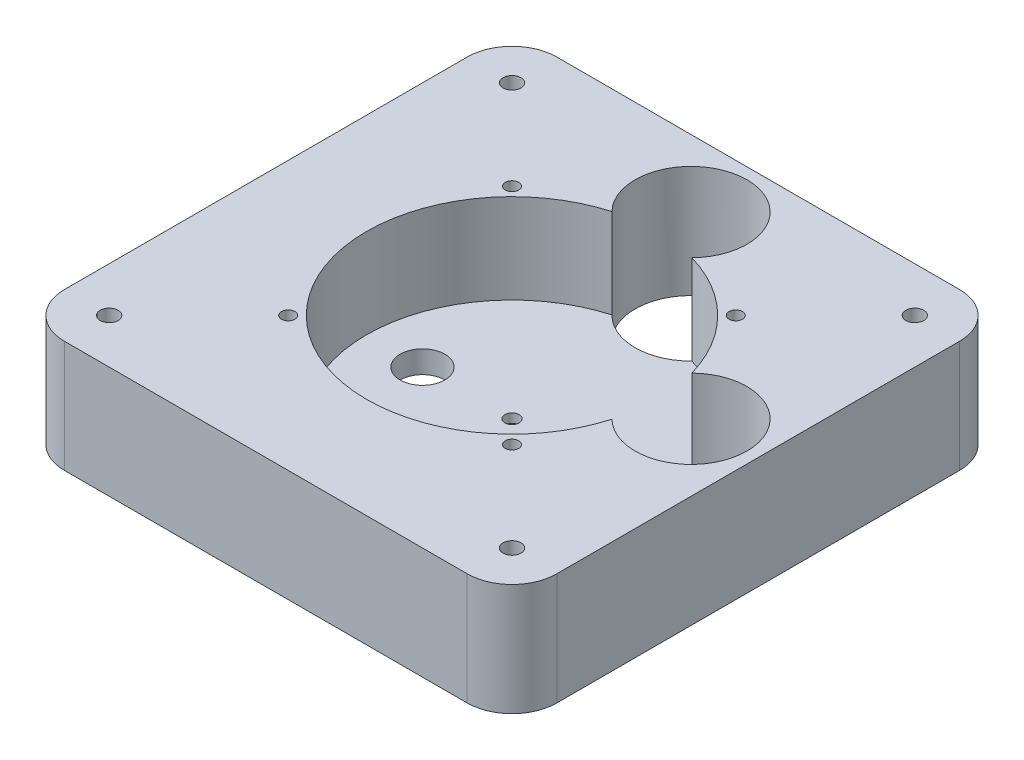
ISO-10303-21;
HEADER;
FILE_DESCRIPTION(('STEP AP214'),'2;1');
FILE_NAME('part.step','',(''),(''),'','','');
FILE_SCHEMA(('AUTOMOTIVE_DESIGN { 1 0 10303 214 1 1 1 1 }'));
ENDSEC;
DATA;
#1=APPLICATION_CONTEXT('core data for automotive mechanical design processes');
#2=APPLICATION_PROTOCOL_DEFINITION('international standard','automotive_design',2000,#1);
#3=PRODUCT_CONTEXT('',#1,'mechanical');
#4=PRODUCT('Part','Part','',(#3));
#5=PRODUCT_RELATED_PRODUCT_CATEGORY('part','',(#4));
#6=PRODUCT_DEFINITION_FORMATION('','',#4);
#7=PRODUCT_DEFINITION_CONTEXT('part definition',#1,'design');
#8=PRODUCT_DEFINITION('design','',#6,#7);
#9=PRODUCT_DEFINITION_SHAPE('','',#8);
#10=(LENGTH_UNIT() NAMED_UNIT(*) SI_UNIT(.MILLI.,.METRE.));
#11=(NAMED_UNIT(*) PLANE_ANGLE_UNIT() SI_UNIT($,.RADIAN.));
#12=(NAMED_UNIT(*) SI_UNIT($,.STERADIAN.) SOLID_ANGLE_UNIT());
#13=UNCERTAINTY_MEASURE_WITH_UNIT(LENGTH_MEASURE(1.E-05),#10,'distance_accuracy_value','');
#14=(GEOMETRIC_REPRESENTATION_CONTEXT(3) GLOBAL_UNCERTAINTY_ASSIGNED_CONTEXT((#13)) GLOBAL_UNIT_ASSIGNED_CONTEXT((#10,
#11,#12)) REPRESENTATION_CONTEXT('',''));
#15=CARTESIAN_POINT('',(0.,0.,0.));
#16=DIRECTION('',(0.,0.,1.));
#17=DIRECTION('',(1.,0.,0.));
#18=AXIS2_PLACEMENT_3D('',#15,#16,#17);
#19=CARTESIAN_POINT('',(25.,0.,-25.));
#20=DIRECTION('',(0.,1.,0.));
#21=DIRECTION('',(0.,0.,1.));
#22=AXIS2_PLACEMENT_3D('',#19,#20,#21);
#23=CYLINDRICAL_SURFACE('',#22,1.5);
#24=CARTESIAN_POINT('',(25.,25.,-25.));
#25=DIRECTION('',(0.,1.,0.));
#26=DIRECTION('',(0.,0.,1.));
#27=AXIS2_PLACEMENT_3D('',#24,#25,#26);
#28=CIRCLE('',#27,1.5);
#29=CARTESIAN_POINT('',(25.,25.,-23.5));
#30=VERTEX_POINT('',#29);
#31=EDGE_CURVE('E272',#30,#30,#28,.T.);
#32=ORIENTED_EDGE('',*,*,#31,.T.);
#33=EDGE_LOOP('',(#32));
#34=FACE_BOUND('',#33,.T.);
#35=CARTESIAN_POINT('',(25.,13.,-25.));
#36=DIRECTION('',(0.,-1.,0.));
#37=DIRECTION('',(0.,0.,-1.));
#38=AXIS2_PLACEMENT_3D('',#35,#36,#37);
#39=CIRCLE('',#38,1.5);
#40=CARTESIAN_POINT('',(25.,13.,-26.5));
#41=VERTEX_POINT('',#40);
#42=EDGE_CURVE('E12',#41,#41,#39,.F.);
#43=ORIENTED_EDGE('',*,*,#42,.F.);
#44=EDGE_LOOP('',(#43));
#45=FACE_BOUND('',#44,.T.);
#46=ADVANCED_FACE('F40',(#34,#45),#23,.F.);
#47=CARTESIAN_POINT('',(-25.,0.,-25.));
#48=DIRECTION('',(0.,1.,0.));
#49=DIRECTION('',(0.,0.,1.));
#50=AXIS2_PLACEMENT_3D('',#47,#48,#49);
#51=CYLINDRICAL_SURFACE('',#50,1.5);
#52=CARTESIAN_POINT('',(-25.,25.,-25.));
#53=DIRECTION('',(0.,1.,0.));
#54=DIRECTION('',(0.,0.,1.));
#55=AXIS2_PLACEMENT_3D('',#52,#53,#54);
#56=CIRCLE('',#55,1.5);
#57=CARTESIAN_POINT('',(-25.,25.,-23.5));
#58=VERTEX_POINT('',#57);
#59=EDGE_CURVE('E276',#58,#58,#56,.T.);
#60=ORIENTED_EDGE('',*,*,#59,.T.);
#61=EDGE_LOOP('',(#60));
#62=FACE_BOUND('',#61,.T.);
#63=CARTESIAN_POINT('',(-25.,13.,-25.));
#64=DIRECTION('',(0.,-1.,0.));
#65=DIRECTION('',(0.,0.,-1.));
#66=AXIS2_PLACEMENT_3D('',#63,#64,#65);
#67=CIRCLE('',#66,1.5);
#68=CARTESIAN_POINT('',(-25.,13.,-26.5));
#69=VERTEX_POINT('',#68);
#70=EDGE_CURVE('E49',#69,#69,#67,.F.);
#71=ORIENTED_EDGE('',*,*,#70,.F.);
#72=EDGE_LOOP('',(#71));
#73=FACE_BOUND('',#72,.T.);
#74=ADVANCED_FACE('F348',(#62,#73),#51,.F.);
#75=CARTESIAN_POINT('',(-25.,0.,25.));
#76=DIRECTION('',(0.,1.,0.));
#77=DIRECTION('',(0.,0.,1.));
#78=AXIS2_PLACEMENT_3D('',#75,#76,#77);
#79=CYLINDRICAL_SURFACE('',#78,1.5);
#80=CARTESIAN_POINT('',(-25.,25.,25.));
#81=DIRECTION('',(0.,1.,0.));
#82=DIRECTION('',(0.,0.,1.));
#83=AXIS2_PLACEMENT_3D('',#80,#81,#82);
#84=CIRCLE('',#83,1.5);
#85=CARTESIAN_POINT('',(-25.,25.,26.5));
#86=VERTEX_POINT('',#85);
#87=EDGE_CURVE('E264',#86,#86,#84,.T.);
#88=ORIENTED_EDGE('',*,*,#87,.T.);
#89=EDGE_LOOP('',(#88));
#90=FACE_BOUND('',#89,.T.);
#91=CARTESIAN_POINT('',(-25.,13.,25.));
#92=DIRECTION('',(0.,-1.,0.));
#93=DIRECTION('',(0.,0.,-1.));
#94=AXIS2_PLACEMENT_3D('',#91,#92,#93);
#95=CIRCLE('',#94,1.5);
#96=CARTESIAN_POINT('',(-25.,13.,23.5));
#97=VERTEX_POINT('',#96);
#98=EDGE_CURVE('E339',#97,#97,#95,.F.);
#99=ORIENTED_EDGE('',*,*,#98,.F.);
#100=EDGE_LOOP('',(#99));
#101=FACE_BOUND('',#100,.T.);
#102=ADVANCED_FACE('F350',(#90,#101),#79,.F.);
#103=CARTESIAN_POINT('',(25.,0.,25.));
#104=DIRECTION('',(0.,1.,0.));
#105=DIRECTION('',(0.,0.,1.));
#106=AXIS2_PLACEMENT_3D('',#103,#104,#105);
#107=CYLINDRICAL_SURFACE('',#106,1.5);
#108=CARTESIAN_POINT('',(25.,25.,25.));
#109=DIRECTION('',(0.,1.,0.));
#110=DIRECTION('',(0.,0.,1.));
#111=AXIS2_PLACEMENT_3D('',#108,#109,#110);
#112=CIRCLE('',#111,1.5);
#113=CARTESIAN_POINT('',(25.,25.,26.5));
#114=VERTEX_POINT('',#113);
#115=EDGE_CURVE('E260',#114,#114,#112,.T.);
#116=ORIENTED_EDGE('',*,*,#115,.T.);
#117=EDGE_LOOP('',(#116));
#118=FACE_BOUND('',#117,.T.);
#119=CARTESIAN_POINT('',(25.,13.,25.));
#120=DIRECTION('',(0.,-1.,0.));
#121=DIRECTION('',(0.,0.,-1.));
#122=AXIS2_PLACEMENT_3D('',#119,#120,#121);
#123=CIRCLE('',#122,1.5);
#124=CARTESIAN_POINT('',(25.,13.,23.5));
#125=VERTEX_POINT('',#124);
#126=EDGE_CURVE('E331',#125,#125,#123,.F.);
#127=ORIENTED_EDGE('',*,*,#126,.F.);
#128=EDGE_LOOP('',(#127));
#129=FACE_BOUND('',#128,.T.);
#130=ADVANCED_FACE('F357',(#118,#129),#107,.F.);
#131=CARTESIAN_POINT('',(0.,-5.,0.));
#132=DIRECTION('',(0.,1.,0.));
#133=DIRECTION('',(0.,0.,1.));
#134=AXIS2_PLACEMENT_3D('',#131,#132,#133);
#135=CYLINDRICAL_SURFACE('',#134,1.6);
#136=CARTESIAN_POINT('',(0.,5.,0.));
#137=DIRECTION('',(0.,1.,0.));
#138=DIRECTION('',(0.,0.,1.));
#139=AXIS2_PLACEMENT_3D('',#136,#137,#138);
#140=CIRCLE('',#139,1.6);
#141=CARTESIAN_POINT('',(0.,5.,1.6));
#142=VERTEX_POINT('',#141);
#143=EDGE_CURVE('E231',#142,#142,#140,.T.);
#144=ORIENTED_EDGE('',*,*,#143,.T.);
#145=EDGE_LOOP('',(#144));
#146=FACE_BOUND('',#145,.T.);
#147=CARTESIAN_POINT('',(0.,3.,0.));
#148=DIRECTION('',(0.,-1.,0.));
#149=DIRECTION('',(0.,0.,-1.));
#150=AXIS2_PLACEMENT_3D('',#147,#148,#149);
#151=CIRCLE('',#150,1.6);
#152=CARTESIAN_POINT('',(0.,3.,-1.6));
#153=VERTEX_POINT('',#152);
#154=EDGE_CURVE('E178',#153,#153,#151,.F.);
#155=ORIENTED_EDGE('',*,*,#154,.F.);
#156=EDGE_LOOP('',(#155));
#157=FACE_BOUND('',#156,.T.);
#158=ADVANCED_FACE('F389',(#146,#157),#135,.F.);
#159=CARTESIAN_POINT('',(0.,25.,0.));
#160=DIRECTION('',(0.,1.,0.));
#161=DIRECTION('',(0.,0.,1.));
#162=AXIS2_PLACEMENT_3D('',#159,#160,#161);
#163=PLANE('',#162);
#164=CARTESIAN_POINT('',(0.,25.,-40.));
#165=DIRECTION('',(0.,1.,0.));
#166=DIRECTION('',(0.,0.,1.));
#167=AXIS2_PLACEMENT_3D('',#164,#165,#166);
#168=CIRCLE('',#167,12.5);
#169=CARTESIAN_POINT('',(8.92678553567856,25.,-31.25));
#170=VERTEX_POINT('',#169);
#171=CARTESIAN_POINT('',(-8.92678553567855,25.,-31.25));
#172=VERTEX_POINT('',#171);
#173=EDGE_CURVE('E302',#170,#172,#168,.T.);
#174=ORIENTED_EDGE('',*,*,#173,.F.);
#175=CARTESIAN_POINT('',(0.,25.,0.));
#176=DIRECTION('',(0.,1.,0.));
#177=DIRECTION('',(0.,0.,1.));
#178=AXIS2_PLACEMENT_3D('',#175,#176,#177);
#179=CIRCLE('',#178,32.5);
#180=CARTESIAN_POINT('',(31.25,25.,-8.92678553567855));
#181=VERTEX_POINT('',#180);
#182=EDGE_CURVE('E299',#181,#170,#179,.T.);
#183=ORIENTED_EDGE('',*,*,#182,.F.);
#184=CARTESIAN_POINT('',(40.,25.,0.));
#185=DIRECTION('',(0.,1.,0.));
#186=DIRECTION('',(0.,0.,1.));
#187=AXIS2_PLACEMENT_3D('',#184,#185,#186);
#188=CIRCLE('',#187,12.5);
#189=CARTESIAN_POINT('',(31.25,25.,8.92678553567856));
#190=VERTEX_POINT('',#189);
#191=EDGE_CURVE('E309',#190,#181,#188,.T.);
#192=ORIENTED_EDGE('',*,*,#191,.F.);
#193=CARTESIAN_POINT('',(0.,25.,0.));
#194=DIRECTION('',(0.,1.,0.));
#195=DIRECTION('',(0.,0.,1.));
#196=AXIS2_PLACEMENT_3D('',#193,#194,#195);
#197=CIRCLE('',#196,32.5);
#198=EDGE_CURVE('E305',#172,#190,#197,.T.);
#199=ORIENTED_EDGE('',*,*,#198,.F.);
#200=EDGE_LOOP('',(#174,#183,#192,#199));
#201=FACE_BOUND('',#200,.T.);
#202=ORIENTED_EDGE('',*,*,#59,.F.);
#203=EDGE_LOOP('',(#202));
#204=FACE_BOUND('',#203,.T.);
#205=CARTESIAN_POINT('',(45.,25.,45.));
#206=DIRECTION('',(0.,1.,0.));
#207=DIRECTION('',(0.,0.,1.));
#208=AXIS2_PLACEMENT_3D('',#205,#206,#207);
#209=CIRCLE('',#208,2.);
#210=CARTESIAN_POINT('',(45.,25.,47.));
#211=VERTEX_POINT('',#210);
#212=EDGE_CURVE('E249',#211,#211,#209,.T.);
#213=ORIENTED_EDGE('',*,*,#212,.F.);
#214=EDGE_LOOP('',(#213));
#215=FACE_BOUND('',#214,.T.);
#216=CARTESIAN_POINT('',(-45.,25.,-45.));
#217=DIRECTION('',(0.,1.,0.));
#218=DIRECTION('',(0.,0.,1.));
#219=AXIS2_PLACEMENT_3D('',#216,#217,#218);
#220=CIRCLE('',#219,2.);
#221=CARTESIAN_POINT('',(-45.,25.,-43.));
#222=VERTEX_POINT('',#221);
#223=EDGE_CURVE('E240',#222,#222,#220,.T.);
#224=ORIENTED_EDGE('',*,*,#223,.F.);
#225=EDGE_LOOP('',(#224));
#226=FACE_BOUND('',#225,.T.);
#227=CARTESIAN_POINT('',(-45.,25.,45.));
#228=DIRECTION('',(0.,1.,0.));
#229=DIRECTION('',(0.,0.,1.));
#230=AXIS2_PLACEMENT_3D('',#227,#228,#229);
#231=CIRCLE('',#230,2.);
#232=CARTESIAN_POINT('',(-45.,25.,47.));
#233=VERTEX_POINT('',#232);
#234=EDGE_CURVE('E235',#233,#233,#231,.T.);
#235=ORIENTED_EDGE('',*,*,#234,.F.);
#236=EDGE_LOOP('',(#235));
#237=FACE_BOUND('',#236,.T.);
#238=ORIENTED_EDGE('',*,*,#31,.F.);
#239=EDGE_LOOP('',(#238));
#240=FACE_BOUND('',#239,.T.);
#241=ORIENTED_EDGE('',*,*,#87,.F.);
#242=EDGE_LOOP('',(#241));
#243=FACE_BOUND('',#242,.T.);
#244=ORIENTED_EDGE('',*,*,#115,.F.);
#245=EDGE_LOOP('',(#244));
#246=FACE_BOUND('',#245,.T.);
#247=CARTESIAN_POINT('',(45.,25.,-45.));
#248=DIRECTION('',(0.,1.,0.));
#249=DIRECTION('',(0.,0.,1.));
#250=AXIS2_PLACEMENT_3D('',#247,#248,#249);
#251=CIRCLE('',#250,2.);
#252=CARTESIAN_POINT('',(45.,25.,-43.));
#253=VERTEX_POINT('',#252);
#254=EDGE_CURVE('E248',#253,#253,#251,.T.);
#255=ORIENTED_EDGE('',*,*,#254,.F.);
#256=EDGE_LOOP('',(#255));
#257=FACE_BOUND('',#256,.T.);
#258=DIRECTION('',(1.,0.,0.));
#259=VECTOR('',#258,1.);
#260=CARTESIAN_POINT('',(44.9999999999999,25.,55.));
#261=LINE('',#260,#259);
#262=CARTESIAN_POINT('',(-44.9999999999999,25.,55.));
#263=VERTEX_POINT('',#262);
#264=CARTESIAN_POINT('',(44.9999999999999,25.,55.));
#265=VERTEX_POINT('',#264);
#266=EDGE_CURVE('E198',#263,#265,#261,.T.);
#267=ORIENTED_EDGE('',*,*,#266,.T.);
#268=CARTESIAN_POINT('',(45.,25.,45.));
#269=DIRECTION('',(0.,1.,0.));
#270=DIRECTION('',(0.,0.,1.));
#271=AXIS2_PLACEMENT_3D('',#268,#269,#270);
#272=CIRCLE('',#271,10.);
#273=CARTESIAN_POINT('',(55.,25.,44.9999999999999));
#274=VERTEX_POINT('',#273);
#275=EDGE_CURVE('E173',#265,#274,#272,.T.);
#276=ORIENTED_EDGE('',*,*,#275,.T.);
#277=DIRECTION('',(0.,0.,-1.));
#278=VECTOR('',#277,1.);
#279=CARTESIAN_POINT('',(55.,25.,44.9999999999999));
#280=LINE('',#279,#278);
#281=CARTESIAN_POINT('',(55.,25.,-44.9999999999999));
#282=VERTEX_POINT('',#281);
#283=EDGE_CURVE('E177',#274,#282,#280,.T.);
#284=ORIENTED_EDGE('',*,*,#283,.T.);
#285=CARTESIAN_POINT('',(45.,25.,-45.));
#286=DIRECTION('',(0.,1.,0.));
#287=DIRECTION('',(0.,0.,1.));
#288=AXIS2_PLACEMENT_3D('',#285,#286,#287);
#289=CIRCLE('',#288,10.);
#290=CARTESIAN_POINT('',(44.9999999999999,25.,-55.));
#291=VERTEX_POINT('',#290);
#292=EDGE_CURVE('E56',#282,#291,#289,.T.);
#293=ORIENTED_EDGE('',*,*,#292,.T.);
#294=DIRECTION('',(-1.,0.,0.));
#295=VECTOR('',#294,1.);
#296=CARTESIAN_POINT('',(44.9999999999999,25.,-55.));
#297=LINE('',#296,#295);
#298=CARTESIAN_POINT('',(-44.9999999999999,25.,-55.));
#299=VERTEX_POINT('',#298);
#300=EDGE_CURVE('E137',#291,#299,#297,.T.);
#301=ORIENTED_EDGE('',*,*,#300,.T.);
#302=CARTESIAN_POINT('',(-45.,25.,-45.));
#303=DIRECTION('',(0.,1.,0.));
#304=DIRECTION('',(0.,0.,1.));
#305=AXIS2_PLACEMENT_3D('',#302,#303,#304);
#306=CIRCLE('',#305,10.);
#307=CARTESIAN_POINT('',(-55.,25.,-44.9999999999999));
#308=VERTEX_POINT('',#307);
#309=EDGE_CURVE('E186',#299,#308,#306,.T.);
#310=ORIENTED_EDGE('',*,*,#309,.T.);
#311=DIRECTION('',(0.,0.,1.));
#312=VECTOR('',#311,1.);
#313=CARTESIAN_POINT('',(-55.,25.,44.9999999999999));
#314=LINE('',#313,#312);
#315=CARTESIAN_POINT('',(-55.,25.,44.9999999999999));
#316=VERTEX_POINT('',#315);
#317=EDGE_CURVE('E190',#308,#316,#314,.T.);
#318=ORIENTED_EDGE('',*,*,#317,.T.);
#319=CARTESIAN_POINT('',(-45.,25.,45.));
#320=DIRECTION('',(0.,1.,0.));
#321=DIRECTION('',(0.,0.,-1.));
#322=AXIS2_PLACEMENT_3D('',#319,#320,#321);
#323=CIRCLE('',#322,10.);
#324=EDGE_CURVE('E194',#316,#263,#323,.T.);
#325=ORIENTED_EDGE('',*,*,#324,.T.);
#326=EDGE_LOOP('',(#267,#276,#284,#293,#301,#310,#318,#325));
#327=FACE_BOUND('',#326,.T.);
#328=ADVANCED_FACE('F387',(#201,#204,#215,#226,#237,#240,#243,#246,#257,#327),#163,.T.);
#329=CARTESIAN_POINT('',(0.,0.,0.));
#330=DIRECTION('',(0.,1.,0.));
#331=DIRECTION('',(0.,0.,1.));
#332=AXIS2_PLACEMENT_3D('',#329,#330,#331);
#333=PLANE('',#332);
#334=CARTESIAN_POINT('',(21.920310216783,0.,-40.));
#335=DIRECTION('',(0.,-1.,0.));
#336=DIRECTION('',(0.,0.,-1.));
#337=AXIS2_PLACEMENT_3D('',#334,#335,#336);
#338=CIRCLE('',#337,3.5);
#339=CARTESIAN_POINT('',(21.920310216783,0.,-43.5));
#340=VERTEX_POINT('',#339);
#341=EDGE_CURVE('E482',#340,#340,#338,.T.);
#342=ORIENTED_EDGE('',*,*,#341,.F.);
#343=EDGE_LOOP('',(#342));
#344=FACE_BOUND('',#343,.T.);
#345=CARTESIAN_POINT('',(40.,0.,-21.920310216783));
#346=DIRECTION('',(0.,-1.,0.));
#347=DIRECTION('',(0.,0.,-1.));
#348=AXIS2_PLACEMENT_3D('',#345,#346,#347);
#349=CIRCLE('',#348,3.5);
#350=CARTESIAN_POINT('',(40.,0.,-25.420310216783));
#351=VERTEX_POINT('',#350);
#352=EDGE_CURVE('E474',#351,#351,#349,.T.);
#353=ORIENTED_EDGE('',*,*,#352,.F.);
#354=EDGE_LOOP('',(#353));
#355=FACE_BOUND('',#354,.T.);
#356=CARTESIAN_POINT('',(40.,0.,21.920310216783));
#357=DIRECTION('',(0.,-1.,0.));
#358=DIRECTION('',(0.,0.,-1.));
#359=AXIS2_PLACEMENT_3D('',#356,#357,#358);
#360=CIRCLE('',#359,3.5);
#361=CARTESIAN_POINT('',(40.,0.,18.420310216783));
#362=VERTEX_POINT('',#361);
#363=EDGE_CURVE('E466',#362,#362,#360,.T.);
#364=ORIENTED_EDGE('',*,*,#363,.F.);
#365=EDGE_LOOP('',(#364));
#366=FACE_BOUND('',#365,.T.);
#367=CARTESIAN_POINT('',(-47.0000000000055,0.,25.0000000000007));
#368=DIRECTION('',(0.,-1.,0.));
#369=DIRECTION('',(0.,0.,-1.));
#370=AXIS2_PLACEMENT_3D('',#367,#368,#369);
#371=CIRCLE('',#370,3.5);
#372=CARTESIAN_POINT('',(-47.0000000000055,0.,21.5000000000007));
#373=VERTEX_POINT('',#372);
#374=EDGE_CURVE('E457',#373,#373,#371,.T.);
#375=ORIENTED_EDGE('',*,*,#374,.F.);
#376=EDGE_LOOP('',(#375));
#377=FACE_BOUND('',#376,.T.);
#378=CARTESIAN_POINT('',(-47.0000000000055,0.,-24.9999999999993));
#379=DIRECTION('',(0.,-1.,0.));
#380=DIRECTION('',(0.,0.,-1.));
#381=AXIS2_PLACEMENT_3D('',#378,#379,#380);
#382=CIRCLE('',#381,3.5);
#383=CARTESIAN_POINT('',(-47.0000000000055,0.,-28.4999999999993));
#384=VERTEX_POINT('',#383);
#385=EDGE_CURVE('E489',#384,#384,#382,.T.);
#386=ORIENTED_EDGE('',*,*,#385,.F.);
#387=EDGE_LOOP('',(#386));
#388=FACE_BOUND('',#387,.T.);
#389=CARTESIAN_POINT('',(-21.920310216783,0.,-40.));
#390=DIRECTION('',(0.,-1.,0.));
#391=DIRECTION('',(0.,0.,-1.));
#392=AXIS2_PLACEMENT_3D('',#389,#390,#391);
#393=CIRCLE('',#392,3.5);
#394=CARTESIAN_POINT('',(-21.920310216783,0.,-43.5));
#395=VERTEX_POINT('',#394);
#396=EDGE_CURVE('E449',#395,#395,#393,.T.);
#397=ORIENTED_EDGE('',*,*,#396,.F.);
#398=EDGE_LOOP('',(#397));
#399=FACE_BOUND('',#398,.T.);
#400=CARTESIAN_POINT('',(0.,0.,0.));
#401=DIRECTION('',(0.,-1.,0.));
#402=DIRECTION('',(0.,0.,-1.));
#403=AXIS2_PLACEMENT_3D('',#400,#401,#402);
#404=CIRCLE('',#403,3.5);
#405=CARTESIAN_POINT('',(0.,0.,-3.5));
#406=VERTEX_POINT('',#405);
#407=EDGE_CURVE('E441',#406,#406,#404,.T.);
#408=ORIENTED_EDGE('',*,*,#407,.F.);
#409=EDGE_LOOP('',(#408));
#410=FACE_BOUND('',#409,.T.);
#411=CARTESIAN_POINT('',(-20.,0.,0.));
#412=DIRECTION('',(0.,-1.,0.));
#413=DIRECTION('',(0.,0.,-1.));
#414=AXIS2_PLACEMENT_3D('',#411,#412,#413);
#415=CIRCLE('',#414,5.);
#416=CARTESIAN_POINT('',(-20.,0.,-5.));
#417=VERTEX_POINT('',#416);
#418=EDGE_CURVE('E283',#417,#417,#415,.T.);
#419=ORIENTED_EDGE('',*,*,#418,.F.);
#420=EDGE_LOOP('',(#419));
#421=FACE_BOUND('',#420,.T.);
#422=CARTESIAN_POINT('',(45.,0.,45.));
#423=DIRECTION('',(0.,1.,0.));
#424=DIRECTION('',(0.,0.,1.));
#425=AXIS2_PLACEMENT_3D('',#422,#423,#424);
#426=CIRCLE('',#425,2.);
#427=CARTESIAN_POINT('',(45.,0.,47.));
#428=VERTEX_POINT('',#427);
#429=EDGE_CURVE('E244',#428,#428,#426,.T.);
#430=ORIENTED_EDGE('',*,*,#429,.T.);
#431=EDGE_LOOP('',(#430));
#432=FACE_BOUND('',#431,.T.);
#433=CARTESIAN_POINT('',(-45.,0.,-45.));
#434=DIRECTION('',(0.,1.,0.));
#435=DIRECTION('',(0.,0.,1.));
#436=AXIS2_PLACEMENT_3D('',#433,#434,#435);
#437=CIRCLE('',#436,2.);
#438=CARTESIAN_POINT('',(-45.,0.,-43.));
#439=VERTEX_POINT('',#438);
#440=EDGE_CURVE('E253',#439,#439,#437,.T.);
#441=ORIENTED_EDGE('',*,*,#440,.T.);
#442=EDGE_LOOP('',(#441));
#443=FACE_BOUND('',#442,.T.);
#444=CARTESIAN_POINT('',(-45.,0.,45.));
#445=DIRECTION('',(0.,1.,0.));
#446=DIRECTION('',(0.,0.,1.));
#447=AXIS2_PLACEMENT_3D('',#444,#445,#446);
#448=CIRCLE('',#447,2.);
#449=CARTESIAN_POINT('',(-45.,0.,47.));
#450=VERTEX_POINT('',#449);
#451=EDGE_CURVE('E236',#450,#450,#448,.T.);
#452=ORIENTED_EDGE('',*,*,#451,.T.);
#453=EDGE_LOOP('',(#452));
#454=FACE_BOUND('',#453,.T.);
#455=CARTESIAN_POINT('',(45.,0.,-45.));
#456=DIRECTION('',(0.,1.,0.));
#457=DIRECTION('',(0.,0.,1.));
#458=AXIS2_PLACEMENT_3D('',#455,#456,#457);
#459=CIRCLE('',#458,2.);
#460=CARTESIAN_POINT('',(45.,0.,-43.));
#461=VERTEX_POINT('',#460);
#462=EDGE_CURVE('E265',#461,#461,#459,.T.);
#463=ORIENTED_EDGE('',*,*,#462,.T.);
#464=EDGE_LOOP('',(#463));
#465=FACE_BOUND('',#464,.T.);
#466=CARTESIAN_POINT('',(0.,0.,-40.));
#467=DIRECTION('',(0.,1.,0.));
#468=DIRECTION('',(0.,0.,1.));
#469=AXIS2_PLACEMENT_3D('',#466,#467,#468);
#470=CIRCLE('',#469,12.5);
#471=CARTESIAN_POINT('',(0.,0.,-27.5));
#472=VERTEX_POINT('',#471);
#473=EDGE_CURVE('E223',#472,#472,#470,.T.);
#474=ORIENTED_EDGE('',*,*,#473,.T.);
#475=EDGE_LOOP('',(#474));
#476=FACE_BOUND('',#475,.T.);
#477=CARTESIAN_POINT('',(40.,0.,0.));
#478=DIRECTION('',(0.,1.,0.));
#479=DIRECTION('',(0.,0.,1.));
#480=AXIS2_PLACEMENT_3D('',#477,#478,#479);
#481=CIRCLE('',#480,12.5);
#482=CARTESIAN_POINT('',(40.,0.,12.5));
#483=VERTEX_POINT('',#482);
#484=EDGE_CURVE('E227',#483,#483,#481,.T.);
#485=ORIENTED_EDGE('',*,*,#484,.T.);
#486=EDGE_LOOP('',(#485));
#487=FACE_BOUND('',#486,.T.);
#488=CARTESIAN_POINT('',(45.,0.,45.));
#489=DIRECTION('',(0.,1.,0.));
#490=DIRECTION('',(0.,0.,1.));
#491=AXIS2_PLACEMENT_3D('',#488,#489,#490);
#492=CIRCLE('',#491,10.);
#493=CARTESIAN_POINT('',(44.9999999999999,0.,55.));
#494=VERTEX_POINT('',#493);
#495=CARTESIAN_POINT('',(55.,0.,44.9999999999999));
#496=VERTEX_POINT('',#495);
#497=EDGE_CURVE('E64',#494,#496,#492,.T.);
#498=ORIENTED_EDGE('',*,*,#497,.F.);
#499=DIRECTION('',(1.,0.,0.));
#500=VECTOR('',#499,1.);
#501=CARTESIAN_POINT('',(44.9999999999999,0.,55.));
#502=LINE('',#501,#500);
#503=CARTESIAN_POINT('',(-44.9999999999999,0.,55.));
#504=VERTEX_POINT('',#503);
#505=EDGE_CURVE('E168',#504,#494,#502,.T.);
#506=ORIENTED_EDGE('',*,*,#505,.F.);
#507=CARTESIAN_POINT('',(-45.,0.,45.));
#508=DIRECTION('',(0.,1.,0.));
#509=DIRECTION('',(0.,0.,-1.));
#510=AXIS2_PLACEMENT_3D('',#507,#508,#509);
#511=CIRCLE('',#510,10.);
#512=CARTESIAN_POINT('',(-55.,0.,44.9999999999999));
#513=VERTEX_POINT('',#512);
#514=EDGE_CURVE('E164',#513,#504,#511,.T.);
#515=ORIENTED_EDGE('',*,*,#514,.F.);
#516=DIRECTION('',(0.,0.,1.));
#517=VECTOR('',#516,1.);
#518=CARTESIAN_POINT('',(-55.,0.,44.9999999999999));
#519=LINE('',#518,#517);
#520=CARTESIAN_POINT('',(-55.,0.,-44.9999999999999));
#521=VERTEX_POINT('',#520);
#522=EDGE_CURVE('E157',#521,#513,#519,.T.);
#523=ORIENTED_EDGE('',*,*,#522,.F.);
#524=CARTESIAN_POINT('',(-45.,0.,-45.));
#525=DIRECTION('',(0.,1.,0.));
#526=DIRECTION('',(0.,0.,1.));
#527=AXIS2_PLACEMENT_3D('',#524,#525,#526);
#528=CIRCLE('',#527,10.);
#529=CARTESIAN_POINT('',(-44.9999999999999,0.,-55.));
#530=VERTEX_POINT('',#529);
#531=EDGE_CURVE('E153',#530,#521,#528,.T.);
#532=ORIENTED_EDGE('',*,*,#531,.F.);
#533=DIRECTION('',(-1.,0.,0.));
#534=VECTOR('',#533,1.);
#535=CARTESIAN_POINT('',(44.9999999999999,0.,-55.));
#536=LINE('',#535,#534);
#537=CARTESIAN_POINT('',(44.9999999999999,0.,-55.));
#538=VERTEX_POINT('',#537);
#539=EDGE_CURVE('E134',#538,#530,#536,.T.);
#540=ORIENTED_EDGE('',*,*,#539,.F.);
#541=CARTESIAN_POINT('',(45.,0.,-45.));
#542=DIRECTION('',(0.,1.,0.));
#543=DIRECTION('',(0.,0.,1.));
#544=AXIS2_PLACEMENT_3D('',#541,#542,#543);
#545=CIRCLE('',#544,10.);
#546=CARTESIAN_POINT('',(55.,0.,-44.9999999999999));
#547=VERTEX_POINT('',#546);
#548=EDGE_CURVE('E143',#547,#538,#545,.T.);
#549=ORIENTED_EDGE('',*,*,#548,.F.);
#550=DIRECTION('',(0.,0.,-1.));
#551=VECTOR('',#550,1.);
#552=CARTESIAN_POINT('',(55.,0.,44.9999999999999));
#553=LINE('',#552,#551);
#554=EDGE_CURVE('E149',#496,#547,#553,.T.);
#555=ORIENTED_EDGE('',*,*,#554,.F.);
#556=EDGE_LOOP('',(#498,#506,#515,#523,#532,#540,#549,#555));
#557=FACE_BOUND('',#556,.T.);
#558=ADVANCED_FACE('F42',(#344,#355,#366,#377,#388,#399,#410,#421,#432,#443,#454,#465,#476,#487,
#557),#333,.F.);
#559=CARTESIAN_POINT('',(0.,25.,0.));
#560=DIRECTION('',(0.,-1.,0.));
#561=DIRECTION('',(0.,0.,-1.));
#562=AXIS2_PLACEMENT_3D('',#559,#560,#561);
#563=CYLINDRICAL_SURFACE('',#562,32.5);
#564=DIRECTION('',(0.,-1.,0.));
#565=VECTOR('',#564,1.);
#566=CARTESIAN_POINT('',(8.92678553567856,25.,-31.25));
#567=LINE('',#566,#565);
#568=CARTESIAN_POINT('',(8.92678553567857,5.,-31.25));
#569=VERTEX_POINT('',#568);
#570=EDGE_CURVE('E324',#170,#569,#567,.T.);
#571=ORIENTED_EDGE('',*,*,#570,.T.);
#572=CARTESIAN_POINT('',(0.,5.,0.));
#573=DIRECTION('',(0.,-1.,0.));
#574=DIRECTION('',(0.,0.,-1.));
#575=AXIS2_PLACEMENT_3D('',#572,#573,#574);
#576=CIRCLE('',#575,32.5);
#577=CARTESIAN_POINT('',(31.25,5.,-8.92678553567856));
#578=VERTEX_POINT('',#577);
#579=EDGE_CURVE('E295',#569,#578,#576,.T.);
#580=ORIENTED_EDGE('',*,*,#579,.T.);
#581=DIRECTION('',(0.,-1.,0.));
#582=VECTOR('',#581,1.);
#583=CARTESIAN_POINT('',(31.25,25.,-8.92678553567855));
#584=LINE('',#583,#582);
#585=EDGE_CURVE('E312',#181,#578,#584,.T.);
#586=ORIENTED_EDGE('',*,*,#585,.F.);
#587=ORIENTED_EDGE('',*,*,#182,.T.);
#588=EDGE_LOOP('',(#571,#580,#586,#587));
#589=FACE_BOUND('',#588,.T.);
#590=ADVANCED_FACE('F383',(#589),#563,.F.);
#591=CARTESIAN_POINT('',(0.,25.,-40.));
#592=DIRECTION('',(0.,-1.,0.));
#593=DIRECTION('',(0.,0.,-1.));
#594=AXIS2_PLACEMENT_3D('',#591,#592,#593);
#595=CYLINDRICAL_SURFACE('',#594,12.5);
#596=DIRECTION('',(0.,-1.,0.));
#597=VECTOR('',#596,1.);
#598=CARTESIAN_POINT('',(-8.92678553567855,25.,-31.25));
#599=LINE('',#598,#597);
#600=CARTESIAN_POINT('',(-8.92678553567856,5.,-31.25));
#601=VERTEX_POINT('',#600);
#602=EDGE_CURVE('E320',#172,#601,#599,.T.);
#603=ORIENTED_EDGE('',*,*,#602,.T.);
#604=CARTESIAN_POINT('',(0.,5.,-40.));
#605=DIRECTION('',(0.,-1.,0.));
#606=DIRECTION('',(0.,0.,-1.));
#607=AXIS2_PLACEMENT_3D('',#604,#605,#606);
#608=CIRCLE('',#607,12.5);
#609=EDGE_CURVE('E328',#569,#601,#608,.T.);
#610=ORIENTED_EDGE('',*,*,#609,.F.);
#611=ORIENTED_EDGE('',*,*,#570,.F.);
#612=ORIENTED_EDGE('',*,*,#173,.T.);
#613=EDGE_LOOP('',(#603,#610,#611,#612));
#614=FACE_BOUND('',#613,.T.);
#615=ORIENTED_EDGE('',*,*,#473,.F.);
#616=EDGE_LOOP('',(#615));
#617=FACE_BOUND('',#616,.T.);
#618=ADVANCED_FACE('F379',(#614,#617),#595,.F.);
#619=CARTESIAN_POINT('',(0.,25.,0.));
#620=DIRECTION('',(0.,-1.,0.));
#621=DIRECTION('',(0.,0.,-1.));
#622=AXIS2_PLACEMENT_3D('',#619,#620,#621);
#623=CYLINDRICAL_SURFACE('',#622,32.5);
#624=DIRECTION('',(0.,-1.,0.));
#625=VECTOR('',#624,1.);
#626=CARTESIAN_POINT('',(31.25,25.,8.92678553567856));
#627=LINE('',#626,#625);
#628=CARTESIAN_POINT('',(31.25,5.,8.92678553567856));
#629=VERTEX_POINT('',#628);
#630=EDGE_CURVE('E316',#190,#629,#627,.T.);
#631=ORIENTED_EDGE('',*,*,#630,.T.);
#632=CARTESIAN_POINT('',(0.,5.,0.));
#633=DIRECTION('',(0.,-1.,0.));
#634=DIRECTION('',(0.,0.,-1.));
#635=AXIS2_PLACEMENT_3D('',#632,#633,#634);
#636=CIRCLE('',#635,32.5);
#637=EDGE_CURVE('E288',#629,#601,#636,.T.);
#638=ORIENTED_EDGE('',*,*,#637,.T.);
#639=ORIENTED_EDGE('',*,*,#602,.F.);
#640=ORIENTED_EDGE('',*,*,#198,.T.);
#641=EDGE_LOOP('',(#631,#638,#639,#640));
#642=FACE_BOUND('',#641,.T.);
#643=ADVANCED_FACE('F375',(#642),#623,.F.);
#644=CARTESIAN_POINT('',(40.,25.,0.));
#645=DIRECTION('',(0.,-1.,0.));
#646=DIRECTION('',(0.,0.,-1.));
#647=AXIS2_PLACEMENT_3D('',#644,#645,#646);
#648=CYLINDRICAL_SURFACE('',#647,12.5);
#649=ORIENTED_EDGE('',*,*,#585,.T.);
#650=CARTESIAN_POINT('',(40.,5.,0.));
#651=DIRECTION('',(0.,1.,0.));
#652=DIRECTION('',(0.,0.,1.));
#653=AXIS2_PLACEMENT_3D('',#650,#651,#652);
#654=CIRCLE('',#653,12.5);
#655=EDGE_CURVE('E205',#578,#629,#654,.T.);
#656=ORIENTED_EDGE('',*,*,#655,.T.);
#657=ORIENTED_EDGE('',*,*,#630,.F.);
#658=ORIENTED_EDGE('',*,*,#191,.T.);
#659=EDGE_LOOP('',(#649,#656,#657,#658));
#660=FACE_BOUND('',#659,.T.);
#661=ORIENTED_EDGE('',*,*,#484,.F.);
#662=EDGE_LOOP('',(#661));
#663=FACE_BOUND('',#662,.T.);
#664=ADVANCED_FACE('F371',(#660,#663),#648,.F.);
#665=CARTESIAN_POINT('',(0.,5.,-20.));
#666=DIRECTION('',(0.,-1.,0.));
#667=DIRECTION('',(0.,0.,-1.));
#668=AXIS2_PLACEMENT_3D('',#665,#666,#667);
#669=PLANE('',#668);
#670=ORIENTED_EDGE('',*,*,#143,.F.);
#671=EDGE_LOOP('',(#670));
#672=FACE_BOUND('',#671,.T.);
#673=CARTESIAN_POINT('',(-20.,5.,0.));
#674=DIRECTION('',(0.,-1.,0.));
#675=DIRECTION('',(0.,0.,-1.));
#676=AXIS2_PLACEMENT_3D('',#673,#674,#675);
#677=CIRCLE('',#676,5.);
#678=CARTESIAN_POINT('',(-20.,5.,-5.));
#679=VERTEX_POINT('',#678);
#680=EDGE_CURVE('E284',#679,#679,#677,.T.);
#681=ORIENTED_EDGE('',*,*,#680,.T.);
#682=EDGE_LOOP('',(#681));
#683=FACE_BOUND('',#682,.T.);
#684=ORIENTED_EDGE('',*,*,#637,.F.);
#685=ORIENTED_EDGE('',*,*,#655,.F.);
#686=ORIENTED_EDGE('',*,*,#579,.F.);
#687=ORIENTED_EDGE('',*,*,#609,.T.);
#688=EDGE_LOOP('',(#684,#685,#686,#687));
#689=FACE_BOUND('',#688,.T.);
#690=ADVANCED_FACE('F367',(#672,#683,#689),#669,.F.);
#691=CARTESIAN_POINT('',(-20.,5.,0.));
#692=DIRECTION('',(0.,-1.,0.));
#693=DIRECTION('',(0.,0.,-1.));
#694=AXIS2_PLACEMENT_3D('',#691,#692,#693);
#695=CYLINDRICAL_SURFACE('',#694,5.);
#696=ORIENTED_EDGE('',*,*,#680,.F.);
#697=EDGE_LOOP('',(#696));
#698=FACE_BOUND('',#697,.T.);
#699=ORIENTED_EDGE('',*,*,#418,.T.);
#700=EDGE_LOOP('',(#699));
#701=FACE_BOUND('',#700,.T.);
#702=ADVANCED_FACE('F363',(#698,#701),#695,.F.);
#703=CARTESIAN_POINT('',(45.,0.,45.));
#704=DIRECTION('',(0.,1.,0.));
#705=DIRECTION('',(0.,0.,1.));
#706=AXIS2_PLACEMENT_3D('',#703,#704,#705);
#707=CYLINDRICAL_SURFACE('',#706,2.);
#708=ORIENTED_EDGE('',*,*,#429,.F.);
#709=EDGE_LOOP('',(#708));
#710=FACE_BOUND('',#709,.T.);
#711=ORIENTED_EDGE('',*,*,#212,.T.);
#712=EDGE_LOOP('',(#711));
#713=FACE_BOUND('',#712,.T.);
#714=ADVANCED_FACE('F366',(#710,#713),#707,.F.);
#715=CARTESIAN_POINT('',(-45.,0.,-45.));
#716=DIRECTION('',(0.,1.,0.));
#717=DIRECTION('',(0.,0.,1.));
#718=AXIS2_PLACEMENT_3D('',#715,#716,#717);
#719=CYLINDRICAL_SURFACE('',#718,2.);
#720=ORIENTED_EDGE('',*,*,#440,.F.);
#721=EDGE_LOOP('',(#720));
#722=FACE_BOUND('',#721,.T.);
#723=ORIENTED_EDGE('',*,*,#223,.T.);
#724=EDGE_LOOP('',(#723));
#725=FACE_BOUND('',#724,.T.);
#726=ADVANCED_FACE('F537',(#722,#725),#719,.F.);
#727=CARTESIAN_POINT('',(-45.,0.,45.));
#728=DIRECTION('',(0.,1.,0.));
#729=DIRECTION('',(0.,0.,1.));
#730=AXIS2_PLACEMENT_3D('',#727,#728,#729);
#731=CYLINDRICAL_SURFACE('',#730,2.);
#732=ORIENTED_EDGE('',*,*,#451,.F.);
#733=EDGE_LOOP('',(#732));
#734=FACE_BOUND('',#733,.T.);
#735=ORIENTED_EDGE('',*,*,#234,.T.);
#736=EDGE_LOOP('',(#735));
#737=FACE_BOUND('',#736,.T.);
#738=ADVANCED_FACE('F530',(#734,#737),#731,.F.);
#739=CARTESIAN_POINT('',(45.,0.,-45.));
#740=DIRECTION('',(0.,1.,0.));
#741=DIRECTION('',(0.,0.,1.));
#742=AXIS2_PLACEMENT_3D('',#739,#740,#741);
#743=CYLINDRICAL_SURFACE('',#742,2.);
#744=ORIENTED_EDGE('',*,*,#462,.F.);
#745=EDGE_LOOP('',(#744));
#746=FACE_BOUND('',#745,.T.);
#747=ORIENTED_EDGE('',*,*,#254,.T.);
#748=EDGE_LOOP('',(#747));
#749=FACE_BOUND('',#748,.T.);
#750=ADVANCED_FACE('F527',(#746,#749),#743,.F.);
#751=CARTESIAN_POINT('',(45.,0.,45.));
#752=DIRECTION('',(0.,1.,0.));
#753=DIRECTION('',(0.,0.,1.));
#754=AXIS2_PLACEMENT_3D('',#751,#752,#753);
#755=CYLINDRICAL_SURFACE('',#754,10.);
#756=ORIENTED_EDGE('',*,*,#275,.F.);
#757=DIRECTION('',(0.,1.,0.));
#758=VECTOR('',#757,1.);
#759=CARTESIAN_POINT('',(44.9999999999999,0.,55.));
#760=LINE('',#759,#758);
#761=EDGE_CURVE('E202',#494,#265,#760,.T.);
#762=ORIENTED_EDGE('',*,*,#761,.F.);
#763=ORIENTED_EDGE('',*,*,#497,.T.);
#764=DIRECTION('',(0.,1.,0.));
#765=VECTOR('',#764,1.);
#766=CARTESIAN_POINT('',(55.,0.,44.9999999999999));
#767=LINE('',#766,#765);
#768=EDGE_CURVE('E172',#496,#274,#767,.T.);
#769=ORIENTED_EDGE('',*,*,#768,.T.);
#770=EDGE_LOOP('',(#756,#762,#763,#769));
#771=FACE_BOUND('',#770,.T.);
#772=ADVANCED_FACE('F424',(#771),#755,.T.);
#773=CARTESIAN_POINT('',(44.9999999999999,0.,55.));
#774=DIRECTION('',(0.,0.,1.));
#775=DIRECTION('',(1.,0.,0.));
#776=AXIS2_PLACEMENT_3D('',#773,#774,#775);
#777=PLANE('',#776);
#778=ORIENTED_EDGE('',*,*,#266,.F.);
#779=DIRECTION('',(0.,1.,0.));
#780=VECTOR('',#779,1.);
#781=CARTESIAN_POINT('',(-44.9999999999999,0.,55.));
#782=LINE('',#781,#780);
#783=EDGE_CURVE('E206',#504,#263,#782,.T.);
#784=ORIENTED_EDGE('',*,*,#783,.F.);
#785=ORIENTED_EDGE('',*,*,#505,.T.);
#786=ORIENTED_EDGE('',*,*,#761,.T.);
#787=EDGE_LOOP('',(#778,#784,#785,#786));
#788=FACE_BOUND('',#787,.T.);
#789=ADVANCED_FACE('F422',(#788),#777,.T.);
#790=CARTESIAN_POINT('',(-45.,0.,45.));
#791=DIRECTION('',(0.,1.,0.));
#792=DIRECTION('',(0.,0.,1.));
#793=AXIS2_PLACEMENT_3D('',#790,#791,#792);
#794=CYLINDRICAL_SURFACE('',#793,10.);
#795=ORIENTED_EDGE('',*,*,#324,.F.);
#796=DIRECTION('',(0.,1.,0.));
#797=VECTOR('',#796,1.);
#798=CARTESIAN_POINT('',(-55.,0.,44.9999999999999));
#799=LINE('',#798,#797);
#800=EDGE_CURVE('E209',#513,#316,#799,.T.);
#801=ORIENTED_EDGE('',*,*,#800,.F.);
#802=ORIENTED_EDGE('',*,*,#514,.T.);
#803=ORIENTED_EDGE('',*,*,#783,.T.);
#804=EDGE_LOOP('',(#795,#801,#802,#803));
#805=FACE_BOUND('',#804,.T.);
#806=ADVANCED_FACE('F436',(#805),#794,.T.);
#807=CARTESIAN_POINT('',(-55.,0.,44.9999999999999));
#808=DIRECTION('',(-1.,0.,0.));
#809=DIRECTION('',(0.,0.,1.));
#810=AXIS2_PLACEMENT_3D('',#807,#808,#809);
#811=PLANE('',#810);
#812=ORIENTED_EDGE('',*,*,#317,.F.);
#813=DIRECTION('',(0.,1.,0.));
#814=VECTOR('',#813,1.);
#815=CARTESIAN_POINT('',(-55.,0.,-44.9999999999999));
#816=LINE('',#815,#814);
#817=EDGE_CURVE('E212',#521,#308,#816,.T.);
#818=ORIENTED_EDGE('',*,*,#817,.F.);
#819=ORIENTED_EDGE('',*,*,#522,.T.);
#820=ORIENTED_EDGE('',*,*,#800,.T.);
#821=EDGE_LOOP('',(#812,#818,#819,#820));
#822=FACE_BOUND('',#821,.T.);
#823=ADVANCED_FACE('F433',(#822),#811,.T.);
#824=CARTESIAN_POINT('',(-45.,0.,-45.));
#825=DIRECTION('',(0.,1.,0.));
#826=DIRECTION('',(0.,0.,1.));
#827=AXIS2_PLACEMENT_3D('',#824,#825,#826);
#828=CYLINDRICAL_SURFACE('',#827,10.);
#829=ORIENTED_EDGE('',*,*,#309,.F.);
#830=DIRECTION('',(0.,1.,0.));
#831=VECTOR('',#830,1.);
#832=CARTESIAN_POINT('',(-44.9999999999999,0.,-55.));
#833=LINE('',#832,#831);
#834=EDGE_CURVE('E139',#530,#299,#833,.T.);
#835=ORIENTED_EDGE('',*,*,#834,.F.);
#836=ORIENTED_EDGE('',*,*,#531,.T.);
#837=ORIENTED_EDGE('',*,*,#817,.T.);
#838=EDGE_LOOP('',(#829,#835,#836,#837));
#839=FACE_BOUND('',#838,.T.);
#840=ADVANCED_FACE('F431',(#839),#828,.T.);
#841=CARTESIAN_POINT('',(44.9999999999999,0.,-55.));
#842=DIRECTION('',(0.,0.,-1.));
#843=DIRECTION('',(-1.,0.,0.));
#844=AXIS2_PLACEMENT_3D('',#841,#842,#843);
#845=PLANE('',#844);
#846=ORIENTED_EDGE('',*,*,#300,.F.);
#847=DIRECTION('',(0.,1.,0.));
#848=VECTOR('',#847,1.);
#849=CARTESIAN_POINT('',(44.9999999999999,0.,-55.));
#850=LINE('',#849,#848);
#851=EDGE_CURVE('E130',#538,#291,#850,.T.);
#852=ORIENTED_EDGE('',*,*,#851,.F.);
#853=ORIENTED_EDGE('',*,*,#539,.T.);
#854=ORIENTED_EDGE('',*,*,#834,.T.);
#855=EDGE_LOOP('',(#846,#852,#853,#854));
#856=FACE_BOUND('',#855,.T.);
#857=ADVANCED_FACE('F132',(#856),#845,.T.);
#858=CARTESIAN_POINT('',(45.,0.,-45.));
#859=DIRECTION('',(0.,1.,0.));
#860=DIRECTION('',(0.,0.,1.));
#861=AXIS2_PLACEMENT_3D('',#858,#859,#860);
#862=CYLINDRICAL_SURFACE('',#861,10.);
#863=ORIENTED_EDGE('',*,*,#292,.F.);
#864=DIRECTION('',(0.,1.,0.));
#865=VECTOR('',#864,1.);
#866=CARTESIAN_POINT('',(55.,0.,-44.9999999999999));
#867=LINE('',#866,#865);
#868=EDGE_CURVE('E140',#547,#282,#867,.T.);
#869=ORIENTED_EDGE('',*,*,#868,.F.);
#870=ORIENTED_EDGE('',*,*,#548,.T.);
#871=ORIENTED_EDGE('',*,*,#851,.T.);
#872=EDGE_LOOP('',(#863,#869,#870,#871));
#873=FACE_BOUND('',#872,.T.);
#874=ADVANCED_FACE('F144',(#873),#862,.T.);
#875=CARTESIAN_POINT('',(55.,0.,44.9999999999999));
#876=DIRECTION('',(1.,0.,0.));
#877=DIRECTION('',(0.,0.,-1.));
#878=AXIS2_PLACEMENT_3D('',#875,#876,#877);
#879=PLANE('',#878);
#880=ORIENTED_EDGE('',*,*,#283,.F.);
#881=ORIENTED_EDGE('',*,*,#768,.F.);
#882=ORIENTED_EDGE('',*,*,#554,.T.);
#883=ORIENTED_EDGE('',*,*,#868,.T.);
#884=EDGE_LOOP('',(#880,#881,#882,#883));
#885=FACE_BOUND('',#884,.T.);
#886=ADVANCED_FACE('F427',(#885),#879,.T.);
#887=CARTESIAN_POINT('',(0.,3.,0.));
#888=DIRECTION('',(0.,-1.,0.));
#889=DIRECTION('',(0.,0.,-1.));
#890=AXIS2_PLACEMENT_3D('',#887,#888,#889);
#891=PLANE('',#890);
#892=CARTESIAN_POINT('',(0.,3.,0.));
#893=DIRECTION('',(0.,-1.,0.));
#894=DIRECTION('',(0.,0.,-1.));
#895=AXIS2_PLACEMENT_3D('',#892,#893,#894);
#896=CIRCLE('',#895,3.5);
#897=CARTESIAN_POINT('',(0.,3.,-3.5));
#898=VERTEX_POINT('',#897);
#899=EDGE_CURVE('E335',#898,#898,#896,.T.);
#900=ORIENTED_EDGE('',*,*,#899,.T.);
#901=EDGE_LOOP('',(#900));
#902=FACE_BOUND('',#901,.T.);
#903=ORIENTED_EDGE('',*,*,#154,.T.);
#904=EDGE_LOOP('',(#903));
#905=FACE_BOUND('',#904,.T.);
#906=ADVANCED_FACE('F552',(#902,#905),#891,.T.);
#907=CARTESIAN_POINT('',(0.,3.,0.));
#908=DIRECTION('',(0.,-1.,0.));
#909=DIRECTION('',(0.,0.,-1.));
#910=AXIS2_PLACEMENT_3D('',#907,#908,#909);
#911=CYLINDRICAL_SURFACE('',#910,3.5);
#912=ORIENTED_EDGE('',*,*,#899,.F.);
#913=EDGE_LOOP('',(#912));
#914=FACE_BOUND('',#913,.T.);
#915=ORIENTED_EDGE('',*,*,#407,.T.);
#916=EDGE_LOOP('',(#915));
#917=FACE_BOUND('',#916,.T.);
#918=ADVANCED_FACE('F565',(#914,#917),#911,.F.);
#919=CARTESIAN_POINT('',(21.920310216783,5.,-40.));
#920=DIRECTION('',(0.,-1.,0.));
#921=DIRECTION('',(0.,0.,-1.));
#922=AXIS2_PLACEMENT_3D('',#919,#920,#921);
#923=CYLINDRICAL_SURFACE('',#922,3.5);
#924=CARTESIAN_POINT('',(21.920310216783,5.,-40.));
#925=DIRECTION('',(0.,-1.,0.));
#926=DIRECTION('',(0.,0.,-1.));
#927=AXIS2_PLACEMENT_3D('',#924,#925,#926);
#928=CIRCLE('',#927,3.5);
#929=CARTESIAN_POINT('',(21.920310216783,5.,-43.5));
#930=VERTEX_POINT('',#929);
#931=EDGE_CURVE('E453',#930,#930,#928,.T.);
#932=ORIENTED_EDGE('',*,*,#931,.F.);
#933=EDGE_LOOP('',(#932));
#934=FACE_BOUND('',#933,.T.);
#935=ORIENTED_EDGE('',*,*,#341,.T.);
#936=EDGE_LOOP('',(#935));
#937=FACE_BOUND('',#936,.T.);
#938=ADVANCED_FACE('F568',(#934,#937),#923,.F.);
#939=CARTESIAN_POINT('',(21.920310216783,5.,-40.));
#940=DIRECTION('',(0.,-1.,0.));
#941=DIRECTION('',(0.,0.,-1.));
#942=AXIS2_PLACEMENT_3D('',#939,#940,#941);
#943=PLANE('',#942);
#944=ORIENTED_EDGE('',*,*,#931,.T.);
#945=EDGE_LOOP('',(#944));
#946=FACE_BOUND('',#945,.T.);
#947=ADVANCED_FACE('F595',(#946),#943,.T.);
#948=CARTESIAN_POINT('',(40.,5.,21.920310216783));
#949=DIRECTION('',(0.,-1.,0.));
#950=DIRECTION('',(0.,0.,-1.));
#951=AXIS2_PLACEMENT_3D('',#948,#949,#950);
#952=CYLINDRICAL_SURFACE('',#951,3.5);
#953=CARTESIAN_POINT('',(40.,5.,21.920310216783));
#954=DIRECTION('',(0.,-1.,0.));
#955=DIRECTION('',(0.,0.,-1.));
#956=AXIS2_PLACEMENT_3D('',#953,#954,#955);
#957=CIRCLE('',#956,3.5);
#958=CARTESIAN_POINT('',(40.,5.,18.420310216783));
#959=VERTEX_POINT('',#958);
#960=EDGE_CURVE('E470',#959,#959,#957,.T.);
#961=ORIENTED_EDGE('',*,*,#960,.F.);
#962=EDGE_LOOP('',(#961));
#963=FACE_BOUND('',#962,.T.);
#964=ORIENTED_EDGE('',*,*,#363,.T.);
#965=EDGE_LOOP('',(#964));
#966=FACE_BOUND('',#965,.T.);
#967=ADVANCED_FACE('F592',(#963,#966),#952,.F.);
#968=CARTESIAN_POINT('',(40.,5.,21.920310216783));
#969=DIRECTION('',(0.,-1.,0.));
#970=DIRECTION('',(0.,0.,-1.));
#971=AXIS2_PLACEMENT_3D('',#968,#969,#970);
#972=PLANE('',#971);
#973=ORIENTED_EDGE('',*,*,#960,.T.);
#974=EDGE_LOOP('',(#973));
#975=FACE_BOUND('',#974,.T.);
#976=ADVANCED_FACE('F577',(#975),#972,.T.);
#977=CARTESIAN_POINT('',(-21.920310216783,5.,-40.));
#978=DIRECTION('',(0.,-1.,0.));
#979=DIRECTION('',(0.,0.,-1.));
#980=AXIS2_PLACEMENT_3D('',#977,#978,#979);
#981=CYLINDRICAL_SURFACE('',#980,3.5);
#982=CARTESIAN_POINT('',(-21.920310216783,5.,-40.));
#983=DIRECTION('',(0.,-1.,0.));
#984=DIRECTION('',(0.,0.,-1.));
#985=AXIS2_PLACEMENT_3D('',#982,#983,#984);
#986=CIRCLE('',#985,3.5);
#987=CARTESIAN_POINT('',(-21.920310216783,5.,-43.5));
#988=VERTEX_POINT('',#987);
#989=EDGE_CURVE('E445',#988,#988,#986,.T.);
#990=ORIENTED_EDGE('',*,*,#989,.F.);
#991=EDGE_LOOP('',(#990));
#992=FACE_BOUND('',#991,.T.);
#993=ORIENTED_EDGE('',*,*,#396,.T.);
#994=EDGE_LOOP('',(#993));
#995=FACE_BOUND('',#994,.T.);
#996=ADVANCED_FACE('F573',(#992,#995),#981,.F.);
#997=CARTESIAN_POINT('',(-21.920310216783,5.,-40.));
#998=DIRECTION('',(0.,-1.,0.));
#999=DIRECTION('',(0.,0.,-1.));
#1000=AXIS2_PLACEMENT_3D('',#997,#998,#999);
#1001=PLANE('',#1000);
#1002=ORIENTED_EDGE('',*,*,#989,.T.);
#1003=EDGE_LOOP('',(#1002));
#1004=FACE_BOUND('',#1003,.T.);
#1005=ADVANCED_FACE('F576',(#1004),#1001,.T.);
#1006=CARTESIAN_POINT('',(40.,5.,-21.920310216783));
#1007=DIRECTION('',(0.,-1.,0.));
#1008=DIRECTION('',(0.,0.,-1.));
#1009=AXIS2_PLACEMENT_3D('',#1006,#1007,#1008);
#1010=CYLINDRICAL_SURFACE('',#1009,3.5);
#1011=CARTESIAN_POINT('',(40.,5.,-21.920310216783));
#1012=DIRECTION('',(0.,-1.,0.));
#1013=DIRECTION('',(0.,0.,-1.));
#1014=AXIS2_PLACEMENT_3D('',#1011,#1012,#1013);
#1015=CIRCLE('',#1014,3.5);
#1016=CARTESIAN_POINT('',(40.,5.,-25.420310216783));
#1017=VERTEX_POINT('',#1016);
#1018=EDGE_CURVE('E478',#1017,#1017,#1015,.T.);
#1019=ORIENTED_EDGE('',*,*,#1018,.F.);
#1020=EDGE_LOOP('',(#1019));
#1021=FACE_BOUND('',#1020,.T.);
#1022=ORIENTED_EDGE('',*,*,#352,.T.);
#1023=EDGE_LOOP('',(#1022));
#1024=FACE_BOUND('',#1023,.T.);
#1025=ADVANCED_FACE('F581',(#1021,#1024),#1010,.F.);
#1026=CARTESIAN_POINT('',(40.,5.,-21.920310216783));
#1027=DIRECTION('',(0.,-1.,0.));
#1028=DIRECTION('',(0.,0.,-1.));
#1029=AXIS2_PLACEMENT_3D('',#1026,#1027,#1028);
#1030=PLANE('',#1029);
#1031=ORIENTED_EDGE('',*,*,#1018,.T.);
#1032=EDGE_LOOP('',(#1031));
#1033=FACE_BOUND('',#1032,.T.);
#1034=ADVANCED_FACE('F502',(#1033),#1030,.T.);
#1035=CARTESIAN_POINT('',(-47.0000000000055,5.,-24.9999999999993));
#1036=DIRECTION('',(0.,-1.,0.));
#1037=DIRECTION('',(0.,0.,-1.));
#1038=AXIS2_PLACEMENT_3D('',#1035,#1036,#1037);
#1039=CYLINDRICAL_SURFACE('',#1038,3.5);
#1040=CARTESIAN_POINT('',(-47.0000000000055,5.,-24.9999999999993));
#1041=DIRECTION('',(0.,-1.,0.));
#1042=DIRECTION('',(0.,0.,-1.));
#1043=AXIS2_PLACEMENT_3D('',#1040,#1041,#1042);
#1044=CIRCLE('',#1043,3.5);
#1045=CARTESIAN_POINT('',(-47.0000000000055,5.,-28.4999999999993));
#1046=VERTEX_POINT('',#1045);
#1047=EDGE_CURVE('E462',#1046,#1046,#1044,.T.);
#1048=ORIENTED_EDGE('',*,*,#1047,.F.);
#1049=EDGE_LOOP('',(#1048));
#1050=FACE_BOUND('',#1049,.T.);
#1051=ORIENTED_EDGE('',*,*,#385,.T.);
#1052=EDGE_LOOP('',(#1051));
#1053=FACE_BOUND('',#1052,.T.);
#1054=ADVANCED_FACE('F499',(#1050,#1053),#1039,.F.);
#1055=CARTESIAN_POINT('',(-47.0000000000055,5.,-24.9999999999993));
#1056=DIRECTION('',(0.,-1.,0.));
#1057=DIRECTION('',(0.,0.,-1.));
#1058=AXIS2_PLACEMENT_3D('',#1055,#1056,#1057);
#1059=PLANE('',#1058);
#1060=ORIENTED_EDGE('',*,*,#1047,.T.);
#1061=EDGE_LOOP('',(#1060));
#1062=FACE_BOUND('',#1061,.T.);
#1063=ADVANCED_FACE('F497',(#1062),#1059,.T.);
#1064=CARTESIAN_POINT('',(-47.0000000000055,5.,25.0000000000007));
#1065=DIRECTION('',(0.,-1.,0.));
#1066=DIRECTION('',(0.,0.,-1.));
#1067=AXIS2_PLACEMENT_3D('',#1064,#1065,#1066);
#1068=CYLINDRICAL_SURFACE('',#1067,3.5);
#1069=CARTESIAN_POINT('',(-47.0000000000055,5.,25.0000000000007));
#1070=DIRECTION('',(0.,-1.,0.));
#1071=DIRECTION('',(0.,0.,-1.));
#1072=AXIS2_PLACEMENT_3D('',#1069,#1070,#1071);
#1073=CIRCLE('',#1072,3.5);
#1074=CARTESIAN_POINT('',(-47.0000000000055,5.,21.5000000000007));
#1075=VERTEX_POINT('',#1074);
#1076=EDGE_CURVE('E461',#1075,#1075,#1073,.T.);
#1077=ORIENTED_EDGE('',*,*,#1076,.F.);
#1078=EDGE_LOOP('',(#1077));
#1079=FACE_BOUND('',#1078,.T.);
#1080=ORIENTED_EDGE('',*,*,#374,.T.);
#1081=EDGE_LOOP('',(#1080));
#1082=FACE_BOUND('',#1081,.T.);
#1083=ADVANCED_FACE('F583',(#1079,#1082),#1068,.F.);
#1084=CARTESIAN_POINT('',(-47.0000000000055,5.,25.0000000000007));
#1085=DIRECTION('',(0.,-1.,0.));
#1086=DIRECTION('',(0.,0.,-1.));
#1087=AXIS2_PLACEMENT_3D('',#1084,#1085,#1086);
#1088=PLANE('',#1087);
#1089=ORIENTED_EDGE('',*,*,#1076,.T.);
#1090=EDGE_LOOP('',(#1089));
#1091=FACE_BOUND('',#1090,.T.);
#1092=ADVANCED_FACE('F586',(#1091),#1088,.T.);
#1093=CARTESIAN_POINT('',(25.,13.,25.));
#1094=DIRECTION('',(0.,-1.,0.));
#1095=DIRECTION('',(0.,0.,-1.));
#1096=AXIS2_PLACEMENT_3D('',#1093,#1094,#1095);
#1097=PLANE('',#1096);
#1098=ORIENTED_EDGE('',*,*,#126,.T.);
#1099=EDGE_LOOP('',(#1098));
#1100=FACE_BOUND('',#1099,.T.);
#1101=ADVANCED_FACE('F590',(#1100),#1097,.F.);
#1102=CARTESIAN_POINT('',(-25.,13.,25.));
#1103=DIRECTION('',(0.,-1.,0.));
#1104=DIRECTION('',(0.,0.,-1.));
#1105=AXIS2_PLACEMENT_3D('',#1102,#1103,#1104);
#1106=PLANE('',#1105);
#1107=ORIENTED_EDGE('',*,*,#98,.T.);
#1108=EDGE_LOOP('',(#1107));
#1109=FACE_BOUND('',#1108,.T.);
#1110=ADVANCED_FACE('F616',(#1109),#1106,.F.);
#1111=CARTESIAN_POINT('',(-25.,13.,-25.));
#1112=DIRECTION('',(0.,-1.,0.));
#1113=DIRECTION('',(0.,0.,-1.));
#1114=AXIS2_PLACEMENT_3D('',#1111,#1112,#1113);
#1115=PLANE('',#1114);
#1116=ORIENTED_EDGE('',*,*,#70,.T.);
#1117=EDGE_LOOP('',(#1116));
#1118=FACE_BOUND('',#1117,.T.);
#1119=ADVANCED_FACE('F346',(#1118),#1115,.F.);
#1120=CARTESIAN_POINT('',(25.,13.,-25.));
#1121=DIRECTION('',(0.,-1.,0.));
#1122=DIRECTION('',(0.,0.,-1.));
#1123=AXIS2_PLACEMENT_3D('',#1120,#1121,#1122);
#1124=PLANE('',#1123);
#1125=ORIENTED_EDGE('',*,*,#42,.T.);
#1126=EDGE_LOOP('',(#1125));
#1127=FACE_BOUND('',#1126,.T.);
#1128=ADVANCED_FACE('F623',(#1127),#1124,.F.);
#1129=CLOSED_SHELL('',(#46,#74,#102,#130,#158,#328,#558,#590,#618,#643,#664,#690,#702,#714,#726,
#738,#750,#772,#789,#806,#823,#840,#857,#874,#886,#906,#918,#938,#947,#967,#976,#996,#1005,
#1025,#1034,#1054,#1063,#1083,#1092,#1101,#1110,#1119,#1128));
#1130=MANIFOLD_SOLID_BREP('B2',#1129);
#1131=ADVANCED_BREP_SHAPE_REPRESENTATION('',(#18,#1130),#14);
#1132=SHAPE_DEFINITION_REPRESENTATION(#9,#1131);
ENDSEC;
END-ISO-10303-21;
